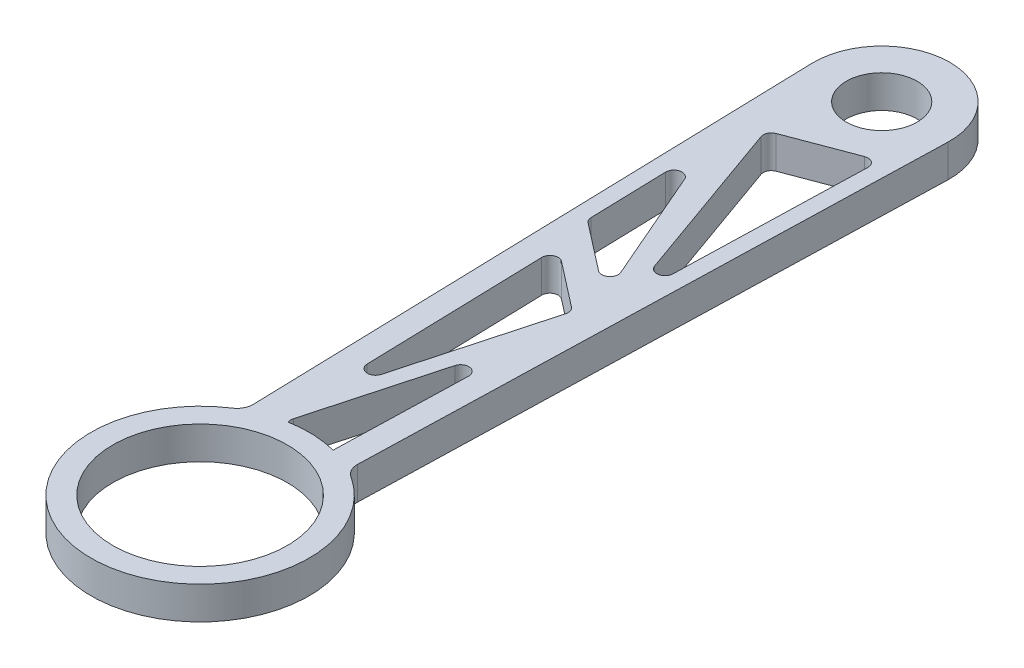
ISO-10303-21;
HEADER;
FILE_DESCRIPTION(('STEP AP214'),'2;1');
FILE_NAME('part.step','',(''),(''),'','','');
FILE_SCHEMA(('AUTOMOTIVE_DESIGN { 1 0 10303 214 1 1 1 1 }'));
ENDSEC;
DATA;
#1=APPLICATION_CONTEXT('core data for automotive mechanical design processes');
#2=APPLICATION_PROTOCOL_DEFINITION('international standard','automotive_design',2000,#1);
#3=PRODUCT_CONTEXT('',#1,'mechanical');
#4=PRODUCT('Part','Part','',(#3));
#5=PRODUCT_RELATED_PRODUCT_CATEGORY('part','',(#4));
#6=PRODUCT_DEFINITION_FORMATION('','',#4);
#7=PRODUCT_DEFINITION_CONTEXT('part definition',#1,'design');
#8=PRODUCT_DEFINITION('design','',#6,#7);
#9=PRODUCT_DEFINITION_SHAPE('','',#8);
#10=(LENGTH_UNIT() NAMED_UNIT(*) SI_UNIT(.MILLI.,.METRE.));
#11=(NAMED_UNIT(*) PLANE_ANGLE_UNIT() SI_UNIT($,.RADIAN.));
#12=(NAMED_UNIT(*) SI_UNIT($,.STERADIAN.) SOLID_ANGLE_UNIT());
#13=UNCERTAINTY_MEASURE_WITH_UNIT(LENGTH_MEASURE(1.E-05),#10,'distance_accuracy_value','');
#14=(GEOMETRIC_REPRESENTATION_CONTEXT(3) GLOBAL_UNCERTAINTY_ASSIGNED_CONTEXT((#13)) GLOBAL_UNIT_ASSIGNED_CONTEXT((#10,
#11,#12)) REPRESENTATION_CONTEXT('',''));
#15=CARTESIAN_POINT('',(0.,0.,0.));
#16=DIRECTION('',(0.,0.,1.));
#17=DIRECTION('',(1.,0.,0.));
#18=AXIS2_PLACEMENT_3D('',#15,#16,#17);
#19=CARTESIAN_POINT('',(0.,12.,0.));
#20=DIRECTION('',(0.,1.,0.));
#21=DIRECTION('',(0.,0.,1.));
#22=AXIS2_PLACEMENT_3D('',#19,#20,#21);
#23=PLANE('',#22);
#24=CARTESIAN_POINT('',(0.,12.,0.));
#25=DIRECTION('',(0.,1.,0.));
#26=DIRECTION('',(0.,0.,1.));
#27=AXIS2_PLACEMENT_3D('',#24,#25,#26);
#28=CIRCLE('',#27,32.);
#29=CARTESIAN_POINT('',(0.,12.,32.));
#30=VERTEX_POINT('',#29);
#31=EDGE_CURVE('E478',#30,#30,#28,.T.);
#32=ORIENTED_EDGE('',*,*,#31,.F.);
#33=EDGE_LOOP('',(#32));
#34=FACE_BOUND('',#33,.T.);
#35=DIRECTION('',(-0.789952118654972,0.,-0.613168533302649));
#36=VECTOR('',#35,1.);
#37=CARTESIAN_POINT('',(-13.0503430260789,12.,-144.472367447696));
#38=LINE('',#37,#36);
#39=CARTESIAN_POINT('',(8.34644282073465,12.,-127.863973742239));
#40=VERTEX_POINT('',#39);
#41=CARTESIAN_POINT('',(-8.03421610357233,12.,-140.578800843722));
#42=VERTEX_POINT('',#41);
#43=EDGE_CURVE('E310',#40,#42,#38,.T.);
#44=ORIENTED_EDGE('',*,*,#43,.F.);
#45=CARTESIAN_POINT('',(6.50693722082672,12.,-125.494117386274));
#46=DIRECTION('',(0.,1.,0.));
#47=DIRECTION('',(0.,0.,1.));
#48=AXIS2_PLACEMENT_3D('',#45,#46,#47);
#49=CIRCLE('',#48,3.);
#50=CARTESIAN_POINT('',(9.40048928643597,12.,-124.70205902756));
#51=VERTEX_POINT('',#50);
#52=EDGE_CURVE('E47',#40,#51,#49,.F.);
#53=ORIENTED_EDGE('',*,*,#52,.T.);
#54=DIRECTION('',(-0.264019452904616,0.,0.964517355203082));
#55=VECTOR('',#54,1.);
#56=CARTESIAN_POINT('',(9.60137553040454,12.,-125.43593778762));
#57=LINE('',#56,#55);
#58=CARTESIAN_POINT('',(-5.1364514497771,12.,-71.5956250986117));
#59=VERTEX_POINT('',#58);
#60=EDGE_CURVE('E307',#51,#59,#57,.T.);
#61=ORIENTED_EDGE('',*,*,#60,.T.);
#62=CARTESIAN_POINT('',(-8.03000351538634,12.,-72.3876834573256));
#63=DIRECTION('',(0.,1.,0.));
#64=DIRECTION('',(0.,0.,1.));
#65=AXIS2_PLACEMENT_3D('',#62,#63,#64);
#66=CIRCLE('',#65,3.);
#67=CARTESIAN_POINT('',(-11.0288272847999,12.,-72.3036834573255));
#68=VERTEX_POINT('',#67);
#69=EDGE_CURVE('E301',#59,#68,#66,.F.);
#70=ORIENTED_EDGE('',*,*,#69,.T.);
#71=DIRECTION('',(0.028,0.,0.999607923137867));
#72=VECTOR('',#71,1.);
#73=CARTESIAN_POINT('',(-10.1751058159417,12.,-41.8255854421963));
#74=LINE('',#73,#72);
#75=CARTESIAN_POINT('',(-12.8725454728939,12.,-138.124944487757));
#76=VERTEX_POINT('',#75);
#77=EDGE_CURVE('E335',#76,#68,#74,.T.);
#78=ORIENTED_EDGE('',*,*,#77,.F.);
#79=CARTESIAN_POINT('',(-9.87372170348028,12.,-138.208944487757));
#80=DIRECTION('',(0.,1.,0.));
#81=DIRECTION('',(0.,0.,1.));
#82=AXIS2_PLACEMENT_3D('',#79,#80,#81);
#83=CIRCLE('',#82,3.);
#84=EDGE_CURVE('E261',#76,#42,#83,.F.);
#85=ORIENTED_EDGE('',*,*,#84,.T.);
#86=EDGE_LOOP('',(#44,#53,#61,#70,#78,#85));
#87=FACE_BOUND('',#86,.T.);
#88=CARTESIAN_POINT('',(0.,12.,0.));
#89=DIRECTION('',(0.,1.,0.));
#90=DIRECTION('',(0.,0.,1.));
#91=AXIS2_PLACEMENT_3D('',#88,#89,#90);
#92=CIRCLE('',#91,40.);
#93=CARTESIAN_POINT('',(10.0877531233555,12.,-38.7070695987468));
#94=VERTEX_POINT('',#93);
#95=CARTESIAN_POINT('',(-7.02274033121261,12.,-39.3786886302777));
#96=VERTEX_POINT('',#95);
#97=EDGE_CURVE('E470',#94,#96,#92,.T.);
#98=ORIENTED_EDGE('',*,*,#97,.T.);
#99=CARTESIAN_POINT('',(-4.28710421094955,12.,-40.6100679453191));
#100=DIRECTION('',(0.,1.,0.));
#101=DIRECTION('',(0.,0.,1.));
#102=AXIS2_PLACEMENT_3D('',#99,#100,#101);
#103=CIRCLE('',#102,3.);
#104=CARTESIAN_POINT('',(-7.1806562765588,12.,-41.4021263040329));
#105=VERTEX_POINT('',#104);
#106=EDGE_CURVE('E243',#96,#105,#103,.F.);
#107=ORIENTED_EDGE('',*,*,#106,.T.);
#108=DIRECTION('',(0.264019452904616,0.,-0.964517355203082));
#109=VECTOR('',#108,1.);
#110=CARTESIAN_POINT('',(15.388479661623,12.,-123.851821070192));
#111=LINE('',#110,#109);
#112=CARTESIAN_POINT('',(5.54894809663972,12.,-87.9059888328851));
#113=VERTEX_POINT('',#112);
#114=EDGE_CURVE('E315',#105,#113,#111,.T.);
#115=ORIENTED_EDGE('',*,*,#114,.T.);
#116=CARTESIAN_POINT('',(8.44250016224896,12.,-87.1139304741712));
#117=DIRECTION('',(0.,1.,0.));
#118=DIRECTION('',(0.,0.,1.));
#119=AXIS2_PLACEMENT_3D('',#116,#117,#118);
#120=CIRCLE('',#119,3.);
#121=CARTESIAN_POINT('',(11.4413239316626,12.,-87.0299304741712));
#122=VERTEX_POINT('',#121);
#123=EDGE_CURVE('E297',#113,#122,#120,.F.);
#124=ORIENTED_EDGE('',*,*,#123,.T.);
#125=DIRECTION('',(0.028,0.,-0.999607923137867));
#126=VECTOR('',#125,1.);
#127=CARTESIAN_POINT('',(12.4949275960138,12.,-124.643879428906));
#128=LINE('',#127,#126);
#129=EDGE_CURVE('E338',#94,#122,#128,.T.);
#130=ORIENTED_EDGE('',*,*,#129,.F.);
#131=EDGE_LOOP('',(#98,#107,#115,#124,#130));
#132=FACE_BOUND('',#131,.T.);
#133=DIRECTION('',(0.028,0.,0.999607923137867));
#134=VECTOR('',#133,1.);
#135=CARTESIAN_POINT('',(-17.9929426164816,12.,0.504));
#136=LINE('',#135,#134);
#137=CARTESIAN_POINT('',(-24.9901980784467,12.,-249.3));
#138=VERTEX_POINT('',#137);
#139=CARTESIAN_POINT('',(-19.0917419612211,12.,-38.7234475335829));
#140=VERTEX_POINT('',#139);
#141=EDGE_CURVE('E386',#138,#140,#136,.T.);
#142=ORIENTED_EDGE('',*,*,#141,.T.);
#143=CARTESIAN_POINT('',(-25.0893895000483,12.,-38.5554475335829));
#144=DIRECTION('',(0.,1.,0.));
#145=DIRECTION('',(0.,0.,1.));
#146=AXIS2_PLACEMENT_3D('',#143,#144,#145);
#147=CIRCLE('',#146,6.);
#148=CARTESIAN_POINT('',(-21.8168604348246,12.,-33.5264761161591));
#149=VERTEX_POINT('',#148);
#150=EDGE_CURVE('E271',#140,#149,#147,.F.);
#151=ORIENTED_EDGE('',*,*,#150,.T.);
#152=CARTESIAN_POINT('',(21.8168604348246,12.,-33.5264761161591));
#153=VERTEX_POINT('',#152);
#154=EDGE_CURVE('E468',#149,#153,#92,.T.);
#155=ORIENTED_EDGE('',*,*,#154,.T.);
#156=CARTESIAN_POINT('',(25.0893895000483,12.,-38.5554475335829));
#157=DIRECTION('',(0.,1.,0.));
#158=DIRECTION('',(0.,0.,1.));
#159=AXIS2_PLACEMENT_3D('',#156,#157,#158);
#160=CIRCLE('',#159,6.);
#161=CARTESIAN_POINT('',(19.0917419612211,12.,-38.7234475335829));
#162=VERTEX_POINT('',#161);
#163=EDGE_CURVE('E277',#153,#162,#160,.F.);
#164=ORIENTED_EDGE('',*,*,#163,.T.);
#165=DIRECTION('',(0.028,0.,-0.999607923137867));
#166=VECTOR('',#165,1.);
#167=CARTESIAN_POINT('',(17.9929426164816,12.,0.504));
#168=LINE('',#167,#166);
#169=CARTESIAN_POINT('',(24.9901980784467,12.,-249.3));
#170=VERTEX_POINT('',#169);
#171=EDGE_CURVE('E381',#162,#170,#168,.T.);
#172=ORIENTED_EDGE('',*,*,#171,.T.);
#173=CARTESIAN_POINT('',(0.,12.,-250.));
#174=DIRECTION('',(0.,1.,0.));
#175=DIRECTION('',(0.,0.,-1.));
#176=AXIS2_PLACEMENT_3D('',#173,#174,#175);
#177=CIRCLE('',#176,25.);
#178=EDGE_CURVE('E383',#170,#138,#177,.T.);
#179=ORIENTED_EDGE('',*,*,#178,.T.);
#180=EDGE_LOOP('',(#142,#151,#155,#164,#172,#179));
#181=FACE_BOUND('',#180,.T.);
#182=CARTESIAN_POINT('',(0.,12.,-250.));
#183=DIRECTION('',(0.,1.,0.));
#184=DIRECTION('',(0.,0.,1.));
#185=AXIS2_PLACEMENT_3D('',#182,#183,#184);
#186=CIRCLE('',#185,13.);
#187=CARTESIAN_POINT('',(0.,12.,-237.));
#188=VERTEX_POINT('',#187);
#189=EDGE_CURVE('E375',#188,#188,#186,.T.);
#190=ORIENTED_EDGE('',*,*,#189,.F.);
#191=EDGE_LOOP('',(#190));
#192=FACE_BOUND('',#191,.T.);
#193=DIRECTION('',(-0.397525373663088,0.,-0.917591182005376));
#194=VECTOR('',#193,1.);
#195=CARTESIAN_POINT('',(-17.7049416979852,12.,-203.5));
#196=LINE('',#195,#194);
#197=CARTESIAN_POINT('',(6.37692660368525,12.,-147.912831321415));
#198=VERTEX_POINT('',#197);
#199=CARTESIAN_POINT('',(-11.5175293173122,12.,-189.217854969559));
#200=VERTEX_POINT('',#199);
#201=EDGE_CURVE('E360',#198,#200,#196,.T.);
#202=ORIENTED_EDGE('',*,*,#201,.F.);
#203=CARTESIAN_POINT('',(3.62415305766912,12.,-146.720255200426));
#204=DIRECTION('',(0.,1.,0.));
#205=DIRECTION('',(0.,0.,1.));
#206=AXIS2_PLACEMENT_3D('',#203,#204,#205);
#207=CIRCLE('',#206,3.);
#208=CARTESIAN_POINT('',(1.78464745776116,12.,-144.350398844461));
#209=VERTEX_POINT('',#208);
#210=EDGE_CURVE('E452',#198,#209,#207,.F.);
#211=ORIENTED_EDGE('',*,*,#210,.T.);
#212=DIRECTION('',(0.789952118654972,0.,0.613168533302648));
#213=VECTOR('',#212,1.);
#214=CARTESIAN_POINT('',(11.0288712194541,12.,-137.174942267257));
#215=LINE('',#214,#213);
#216=CARTESIAN_POINT('',(-15.3248149033725,12.,-157.630930276462));
#217=VERTEX_POINT('',#216);
#218=EDGE_CURVE('E357',#217,#209,#215,.T.);
#219=ORIENTED_EDGE('',*,*,#218,.F.);
#220=CARTESIAN_POINT('',(-13.4853093034645,12.,-160.000786632427));
#221=DIRECTION('',(0.,1.,0.));
#222=DIRECTION('',(0.,0.,1.));
#223=AXIS2_PLACEMENT_3D('',#220,#221,#222);
#224=CIRCLE('',#223,3.);
#225=CARTESIAN_POINT('',(-16.4841330728781,12.,-159.916786632427));
#226=VERTEX_POINT('',#225);
#227=EDGE_CURVE('E444',#217,#226,#224,.F.);
#228=ORIENTED_EDGE('',*,*,#227,.T.);
#229=DIRECTION('',(0.028,0.,0.999607923137867));
#230=VECTOR('',#229,1.);
#231=CARTESIAN_POINT('',(-16.4444474873704,12.,-158.5));
#232=LINE('',#231,#230);
#233=CARTESIAN_POINT('',(-17.2691266327419,12.,-187.94127884857));
#234=VERTEX_POINT('',#233);
#235=EDGE_CURVE('E364',#234,#226,#232,.T.);
#236=ORIENTED_EDGE('',*,*,#235,.F.);
#237=CARTESIAN_POINT('',(-14.2703028633283,12.,-188.02527884857));
#238=DIRECTION('',(0.,1.,0.));
#239=DIRECTION('',(0.,0.,1.));
#240=AXIS2_PLACEMENT_3D('',#237,#238,#239);
#241=CIRCLE('',#240,3.);
#242=EDGE_CURVE('E440',#234,#200,#241,.F.);
#243=ORIENTED_EDGE('',*,*,#242,.T.);
#244=EDGE_LOOP('',(#202,#211,#219,#228,#236,#243));
#245=FACE_BOUND('',#244,.T.);
#246=DIRECTION('',(0.335469277320512,0.,0.94205114721763));
#247=VECTOR('',#246,1.);
#248=CARTESIAN_POINT('',(-12.,12.,-219.5));
#249=LINE('',#248,#247);
#250=CARTESIAN_POINT('',(-11.0122686365186,12.,-216.726293055678));
#251=VERTEX_POINT('',#250);
#252=CARTESIAN_POINT('',(10.5780075140444,12.,-156.097359822692));
#253=VERTEX_POINT('',#252);
#254=EDGE_CURVE('E345',#251,#253,#249,.T.);
#255=ORIENTED_EDGE('',*,*,#254,.F.);
#256=CARTESIAN_POINT('',(-8.18611519486575,12.,-217.73270088764));
#257=DIRECTION('',(0.,1.,0.));
#258=DIRECTION('',(0.,0.,1.));
#259=AXIS2_PLACEMENT_3D('',#256,#257,#258);
#260=CIRCLE('',#259,3.);
#261=CARTESIAN_POINT('',(-9.24527953761206,12.,-220.539508842427));
#262=VERTEX_POINT('',#261);
#263=EDGE_CURVE('E436',#251,#262,#260,.F.);
#264=ORIENTED_EDGE('',*,*,#263,.T.);
#265=DIRECTION('',(-0.93560265159562,0.,0.353054780915433));
#266=VECTOR('',#265,1.);
#267=CARTESIAN_POINT('',(18.4752437155831,12.,-231.));
#268=LINE('',#267,#266);
#269=CARTESIAN_POINT('',(14.2920646215098,12.,-229.421454475285));
#270=VERTEX_POINT('',#269);
#271=EDGE_CURVE('E342',#270,#262,#268,.T.);
#272=ORIENTED_EDGE('',*,*,#271,.F.);
#273=CARTESIAN_POINT('',(15.3512289642561,12.,-226.614646520498));
#274=DIRECTION('',(0.,1.,0.));
#275=DIRECTION('',(0.,0.,1.));
#276=AXIS2_PLACEMENT_3D('',#273,#274,#275);
#277=CIRCLE('',#276,3.);
#278=CARTESIAN_POINT('',(18.3500527336697,12.,-226.530646520498));
#279=VERTEX_POINT('',#278);
#280=EDGE_CURVE('E432',#270,#279,#277,.F.);
#281=ORIENTED_EDGE('',*,*,#280,.T.);
#282=DIRECTION('',(0.028,0.,-0.999607923137867));
#283=VECTOR('',#282,1.);
#284=CARTESIAN_POINT('',(15.9542552943535,12.,-141.));
#285=LINE('',#284,#283);
#286=CARTESIAN_POINT('',(16.4029847251109,12.,-157.019767654654));
#287=VERTEX_POINT('',#286);
#288=EDGE_CURVE('E349',#287,#279,#285,.T.);
#289=ORIENTED_EDGE('',*,*,#288,.F.);
#290=CARTESIAN_POINT('',(13.4041609556973,12.,-157.103767654654));
#291=DIRECTION('',(0.,1.,0.));
#292=DIRECTION('',(0.,0.,1.));
#293=AXIS2_PLACEMENT_3D('',#290,#291,#292);
#294=CIRCLE('',#293,3.);
#295=EDGE_CURVE('E448',#287,#253,#294,.F.);
#296=ORIENTED_EDGE('',*,*,#295,.T.);
#297=EDGE_LOOP('',(#255,#264,#272,#281,#289,#296));
#298=FACE_BOUND('',#297,.T.);
#299=ADVANCED_FACE('F39',(#34,#87,#132,#181,#192,#245,#298),#23,.T.);
#300=CARTESIAN_POINT('',(0.,0.,0.));
#301=DIRECTION('',(0.,1.,0.));
#302=DIRECTION('',(0.,0.,1.));
#303=AXIS2_PLACEMENT_3D('',#300,#301,#302);
#304=PLANE('',#303);
#305=CARTESIAN_POINT('',(0.,0.,0.));
#306=DIRECTION('',(0.,1.,0.));
#307=DIRECTION('',(0.,0.,1.));
#308=AXIS2_PLACEMENT_3D('',#305,#306,#307);
#309=CIRCLE('',#308,32.);
#310=CARTESIAN_POINT('',(0.,0.,32.));
#311=VERTEX_POINT('',#310);
#312=EDGE_CURVE('E316',#311,#311,#309,.T.);
#313=ORIENTED_EDGE('',*,*,#312,.T.);
#314=EDGE_LOOP('',(#313));
#315=FACE_BOUND('',#314,.T.);
#316=DIRECTION('',(0.028,0.,0.999607923137867));
#317=VECTOR('',#316,1.);
#318=CARTESIAN_POINT('',(-10.1751058159417,0.,-41.8255854421963));
#319=LINE('',#318,#317);
#320=CARTESIAN_POINT('',(-12.8725454728939,0.,-138.124944487757));
#321=VERTEX_POINT('',#320);
#322=CARTESIAN_POINT('',(-11.0288272847999,0.,-72.3036834573255));
#323=VERTEX_POINT('',#322);
#324=EDGE_CURVE('E331',#321,#323,#319,.T.);
#325=ORIENTED_EDGE('',*,*,#324,.T.);
#326=CARTESIAN_POINT('',(-8.03000351538634,0.,-72.3876834573256));
#327=DIRECTION('',(0.,1.,0.));
#328=DIRECTION('',(0.,0.,1.));
#329=AXIS2_PLACEMENT_3D('',#326,#327,#328);
#330=CIRCLE('',#329,3.);
#331=CARTESIAN_POINT('',(-5.1364514497771,0.,-71.5956250986117));
#332=VERTEX_POINT('',#331);
#333=EDGE_CURVE('E299',#323,#332,#330,.T.);
#334=ORIENTED_EDGE('',*,*,#333,.T.);
#335=DIRECTION('',(0.264019452904616,0.,-0.964517355203082));
#336=VECTOR('',#335,1.);
#337=CARTESIAN_POINT('',(9.60137553040454,0.,-125.43593778762));
#338=LINE('',#337,#336);
#339=CARTESIAN_POINT('',(9.40048928643597,0.,-124.70205902756));
#340=VERTEX_POINT('',#339);
#341=EDGE_CURVE('E471',#332,#340,#338,.T.);
#342=ORIENTED_EDGE('',*,*,#341,.T.);
#343=CARTESIAN_POINT('',(6.50693722082672,0.,-125.494117386274));
#344=DIRECTION('',(0.,1.,0.));
#345=DIRECTION('',(0.,0.,1.));
#346=AXIS2_PLACEMENT_3D('',#343,#344,#345);
#347=CIRCLE('',#346,3.);
#348=CARTESIAN_POINT('',(8.34644282073465,0.,-127.863973742239));
#349=VERTEX_POINT('',#348);
#350=EDGE_CURVE('E11',#340,#349,#347,.T.);
#351=ORIENTED_EDGE('',*,*,#350,.T.);
#352=DIRECTION('',(-0.789952118654972,0.,-0.613168533302649));
#353=VECTOR('',#352,1.);
#354=CARTESIAN_POINT('',(-13.0503430260789,0.,-144.472367447696));
#355=LINE('',#354,#353);
#356=CARTESIAN_POINT('',(-8.03421610357233,0.,-140.578800843722));
#357=VERTEX_POINT('',#356);
#358=EDGE_CURVE('E321',#349,#357,#355,.T.);
#359=ORIENTED_EDGE('',*,*,#358,.T.);
#360=CARTESIAN_POINT('',(-9.87372170348028,0.,-138.208944487757));
#361=DIRECTION('',(0.,1.,0.));
#362=DIRECTION('',(0.,0.,1.));
#363=AXIS2_PLACEMENT_3D('',#360,#361,#362);
#364=CIRCLE('',#363,3.);
#365=EDGE_CURVE('E256',#357,#321,#364,.T.);
#366=ORIENTED_EDGE('',*,*,#365,.T.);
#367=EDGE_LOOP('',(#325,#334,#342,#351,#359,#366));
#368=FACE_BOUND('',#367,.T.);
#369=DIRECTION('',(0.028,0.,-0.999607923137867));
#370=VECTOR('',#369,1.);
#371=CARTESIAN_POINT('',(12.4949275960138,0.,-124.643879428906));
#372=LINE('',#371,#370);
#373=CARTESIAN_POINT('',(10.0877531233555,0.,-38.7070695987468));
#374=VERTEX_POINT('',#373);
#375=CARTESIAN_POINT('',(11.4413239316626,0.,-87.0299304741712));
#376=VERTEX_POINT('',#375);
#377=EDGE_CURVE('E326',#374,#376,#372,.T.);
#378=ORIENTED_EDGE('',*,*,#377,.T.);
#379=CARTESIAN_POINT('',(8.44250016224896,0.,-87.1139304741712));
#380=DIRECTION('',(0.,1.,0.));
#381=DIRECTION('',(0.,0.,1.));
#382=AXIS2_PLACEMENT_3D('',#379,#380,#381);
#383=CIRCLE('',#382,3.);
#384=CARTESIAN_POINT('',(5.54894809663972,0.,-87.9059888328851));
#385=VERTEX_POINT('',#384);
#386=EDGE_CURVE('E242',#376,#385,#383,.T.);
#387=ORIENTED_EDGE('',*,*,#386,.T.);
#388=DIRECTION('',(-0.264019452904616,0.,0.964517355203082));
#389=VECTOR('',#388,1.);
#390=CARTESIAN_POINT('',(15.388479661623,0.,-123.851821070192));
#391=LINE('',#390,#389);
#392=CARTESIAN_POINT('',(-7.1806562765588,0.,-41.4021263040329));
#393=VERTEX_POINT('',#392);
#394=EDGE_CURVE('E238',#385,#393,#391,.T.);
#395=ORIENTED_EDGE('',*,*,#394,.T.);
#396=CARTESIAN_POINT('',(-4.28710421094955,0.,-40.6100679453191));
#397=DIRECTION('',(0.,1.,0.));
#398=DIRECTION('',(0.,0.,1.));
#399=AXIS2_PLACEMENT_3D('',#396,#397,#398);
#400=CIRCLE('',#399,3.);
#401=CARTESIAN_POINT('',(-7.02274033121261,0.,-39.3786886302777));
#402=VERTEX_POINT('',#401);
#403=EDGE_CURVE('E230',#393,#402,#400,.T.);
#404=ORIENTED_EDGE('',*,*,#403,.T.);
#405=CARTESIAN_POINT('',(0.,0.,0.));
#406=DIRECTION('',(0.,1.,0.));
#407=DIRECTION('',(0.,0.,1.));
#408=AXIS2_PLACEMENT_3D('',#405,#406,#407);
#409=CIRCLE('',#408,40.);
#410=EDGE_CURVE('E235',#402,#374,#409,.F.);
#411=ORIENTED_EDGE('',*,*,#410,.T.);
#412=EDGE_LOOP('',(#378,#387,#395,#404,#411));
#413=FACE_BOUND('',#412,.T.);
#414=DIRECTION('',(0.028,0.,-0.999607923137867));
#415=VECTOR('',#414,1.);
#416=CARTESIAN_POINT('',(17.9929426164816,0.,0.504));
#417=LINE('',#416,#415);
#418=CARTESIAN_POINT('',(19.0917419612211,0.,-38.7234475335829));
#419=VERTEX_POINT('',#418);
#420=CARTESIAN_POINT('',(24.9901980784467,0.,-249.3));
#421=VERTEX_POINT('',#420);
#422=EDGE_CURVE('E378',#419,#421,#417,.T.);
#423=ORIENTED_EDGE('',*,*,#422,.F.);
#424=CARTESIAN_POINT('',(25.0893895000483,0.,-38.5554475335829));
#425=DIRECTION('',(0.,1.,0.));
#426=DIRECTION('',(0.,0.,1.));
#427=AXIS2_PLACEMENT_3D('',#424,#425,#426);
#428=CIRCLE('',#427,6.);
#429=CARTESIAN_POINT('',(21.8168604348246,0.,-33.5264761161591));
#430=VERTEX_POINT('',#429);
#431=EDGE_CURVE('E275',#419,#430,#428,.T.);
#432=ORIENTED_EDGE('',*,*,#431,.T.);
#433=CARTESIAN_POINT('',(-21.8168604348246,0.,-33.5264761161591));
#434=VERTEX_POINT('',#433);
#435=EDGE_CURVE('E252',#430,#434,#409,.F.);
#436=ORIENTED_EDGE('',*,*,#435,.T.);
#437=CARTESIAN_POINT('',(-25.0893895000483,0.,-38.5554475335829));
#438=DIRECTION('',(0.,1.,0.));
#439=DIRECTION('',(0.,0.,1.));
#440=AXIS2_PLACEMENT_3D('',#437,#438,#439);
#441=CIRCLE('',#440,6.);
#442=CARTESIAN_POINT('',(-19.0917419612211,0.,-38.7234475335829));
#443=VERTEX_POINT('',#442);
#444=EDGE_CURVE('E273',#434,#443,#441,.T.);
#445=ORIENTED_EDGE('',*,*,#444,.T.);
#446=DIRECTION('',(0.028,0.,0.999607923137867));
#447=VECTOR('',#446,1.);
#448=CARTESIAN_POINT('',(-17.9929426164816,0.,0.504));
#449=LINE('',#448,#447);
#450=CARTESIAN_POINT('',(-24.9901980784467,0.,-249.3));
#451=VERTEX_POINT('',#450);
#452=EDGE_CURVE('E384',#451,#443,#449,.T.);
#453=ORIENTED_EDGE('',*,*,#452,.F.);
#454=CARTESIAN_POINT('',(0.,0.,-250.));
#455=DIRECTION('',(0.,1.,0.));
#456=DIRECTION('',(0.,0.,-1.));
#457=AXIS2_PLACEMENT_3D('',#454,#455,#456);
#458=CIRCLE('',#457,25.);
#459=EDGE_CURVE('E391',#421,#451,#458,.T.);
#460=ORIENTED_EDGE('',*,*,#459,.F.);
#461=EDGE_LOOP('',(#423,#432,#436,#445,#453,#460));
#462=FACE_BOUND('',#461,.T.);
#463=DIRECTION('',(0.028,0.,0.999607923137867));
#464=VECTOR('',#463,1.);
#465=CARTESIAN_POINT('',(-16.4444474873704,0.,-158.5));
#466=LINE('',#465,#464);
#467=CARTESIAN_POINT('',(-17.2691266327419,0.,-187.94127884857));
#468=VERTEX_POINT('',#467);
#469=CARTESIAN_POINT('',(-16.4841330728781,0.,-159.916786632427));
#470=VERTEX_POINT('',#469);
#471=EDGE_CURVE('E361',#468,#470,#466,.T.);
#472=ORIENTED_EDGE('',*,*,#471,.T.);
#473=CARTESIAN_POINT('',(-13.4853093034645,0.,-160.000786632427));
#474=DIRECTION('',(0.,1.,0.));
#475=DIRECTION('',(0.,0.,1.));
#476=AXIS2_PLACEMENT_3D('',#473,#474,#475);
#477=CIRCLE('',#476,3.);
#478=CARTESIAN_POINT('',(-15.3248149033725,0.,-157.630930276462));
#479=VERTEX_POINT('',#478);
#480=EDGE_CURVE('E442',#470,#479,#477,.T.);
#481=ORIENTED_EDGE('',*,*,#480,.T.);
#482=DIRECTION('',(0.789952118654972,0.,0.613168533302648));
#483=VECTOR('',#482,1.);
#484=CARTESIAN_POINT('',(11.0288712194541,0.,-137.174942267257));
#485=LINE('',#484,#483);
#486=CARTESIAN_POINT('',(1.78464745776116,0.,-144.350398844461));
#487=VERTEX_POINT('',#486);
#488=EDGE_CURVE('E351',#479,#487,#485,.T.);
#489=ORIENTED_EDGE('',*,*,#488,.T.);
#490=CARTESIAN_POINT('',(3.62415305766912,0.,-146.720255200426));
#491=DIRECTION('',(0.,1.,0.));
#492=DIRECTION('',(0.,0.,1.));
#493=AXIS2_PLACEMENT_3D('',#490,#491,#492);
#494=CIRCLE('',#493,3.);
#495=CARTESIAN_POINT('',(6.37692660368525,0.,-147.912831321415));
#496=VERTEX_POINT('',#495);
#497=EDGE_CURVE('E450',#487,#496,#494,.T.);
#498=ORIENTED_EDGE('',*,*,#497,.T.);
#499=DIRECTION('',(-0.397525373663088,0.,-0.917591182005376));
#500=VECTOR('',#499,1.);
#501=CARTESIAN_POINT('',(-17.7049416979852,0.,-203.5));
#502=LINE('',#501,#500);
#503=CARTESIAN_POINT('',(-11.5175293173122,0.,-189.217854969559));
#504=VERTEX_POINT('',#503);
#505=EDGE_CURVE('E370',#496,#504,#502,.T.);
#506=ORIENTED_EDGE('',*,*,#505,.T.);
#507=CARTESIAN_POINT('',(-14.2703028633283,0.,-188.02527884857));
#508=DIRECTION('',(0.,1.,0.));
#509=DIRECTION('',(0.,0.,1.));
#510=AXIS2_PLACEMENT_3D('',#507,#508,#509);
#511=CIRCLE('',#510,3.);
#512=EDGE_CURVE('E438',#504,#468,#511,.T.);
#513=ORIENTED_EDGE('',*,*,#512,.T.);
#514=EDGE_LOOP('',(#472,#481,#489,#498,#506,#513));
#515=FACE_BOUND('',#514,.T.);
#516=CARTESIAN_POINT('',(0.,0.,-250.));
#517=DIRECTION('',(0.,1.,0.));
#518=DIRECTION('',(0.,0.,1.));
#519=AXIS2_PLACEMENT_3D('',#516,#517,#518);
#520=CIRCLE('',#519,13.);
#521=CARTESIAN_POINT('',(0.,0.,-237.));
#522=VERTEX_POINT('',#521);
#523=EDGE_CURVE('E367',#522,#522,#520,.T.);
#524=ORIENTED_EDGE('',*,*,#523,.T.);
#525=EDGE_LOOP('',(#524));
#526=FACE_BOUND('',#525,.T.);
#527=DIRECTION('',(0.028,0.,-0.999607923137867));
#528=VECTOR('',#527,1.);
#529=CARTESIAN_POINT('',(15.9542552943535,0.,-141.));
#530=LINE('',#529,#528);
#531=CARTESIAN_POINT('',(16.4029847251109,0.,-157.019767654654));
#532=VERTEX_POINT('',#531);
#533=CARTESIAN_POINT('',(18.3500527336697,0.,-226.530646520498));
#534=VERTEX_POINT('',#533);
#535=EDGE_CURVE('E346',#532,#534,#530,.T.);
#536=ORIENTED_EDGE('',*,*,#535,.T.);
#537=CARTESIAN_POINT('',(15.3512289642561,0.,-226.614646520498));
#538=DIRECTION('',(0.,1.,0.));
#539=DIRECTION('',(0.,0.,1.));
#540=AXIS2_PLACEMENT_3D('',#537,#538,#539);
#541=CIRCLE('',#540,3.);
#542=CARTESIAN_POINT('',(14.2920646215098,0.,-229.421454475285));
#543=VERTEX_POINT('',#542);
#544=EDGE_CURVE('E430',#534,#543,#541,.T.);
#545=ORIENTED_EDGE('',*,*,#544,.T.);
#546=DIRECTION('',(-0.93560265159562,0.,0.353054780915433));
#547=VECTOR('',#546,1.);
#548=CARTESIAN_POINT('',(18.4752437155831,0.,-231.));
#549=LINE('',#548,#547);
#550=CARTESIAN_POINT('',(-9.24527953761206,0.,-220.539508842427));
#551=VERTEX_POINT('',#550);
#552=EDGE_CURVE('E325',#543,#551,#549,.T.);
#553=ORIENTED_EDGE('',*,*,#552,.T.);
#554=CARTESIAN_POINT('',(-8.18611519486575,0.,-217.73270088764));
#555=DIRECTION('',(0.,1.,0.));
#556=DIRECTION('',(0.,0.,1.));
#557=AXIS2_PLACEMENT_3D('',#554,#555,#556);
#558=CIRCLE('',#557,3.);
#559=CARTESIAN_POINT('',(-11.0122686365186,0.,-216.726293055678));
#560=VERTEX_POINT('',#559);
#561=EDGE_CURVE('E434',#551,#560,#558,.T.);
#562=ORIENTED_EDGE('',*,*,#561,.T.);
#563=DIRECTION('',(0.335469277320512,0.,0.94205114721763));
#564=VECTOR('',#563,1.);
#565=CARTESIAN_POINT('',(-12.,0.,-219.5));
#566=LINE('',#565,#564);
#567=CARTESIAN_POINT('',(10.5780075140444,0.,-156.097359822692));
#568=VERTEX_POINT('',#567);
#569=EDGE_CURVE('E329',#560,#568,#566,.T.);
#570=ORIENTED_EDGE('',*,*,#569,.T.);
#571=CARTESIAN_POINT('',(13.4041609556973,0.,-157.103767654654));
#572=DIRECTION('',(0.,1.,0.));
#573=DIRECTION('',(0.,0.,1.));
#574=AXIS2_PLACEMENT_3D('',#571,#572,#573);
#575=CIRCLE('',#574,3.);
#576=EDGE_CURVE('E446',#568,#532,#575,.T.);
#577=ORIENTED_EDGE('',*,*,#576,.T.);
#578=EDGE_LOOP('',(#536,#545,#553,#562,#570,#577));
#579=FACE_BOUND('',#578,.T.);
#580=ADVANCED_FACE('F233',(#315,#368,#413,#462,#515,#526,#579),#304,.F.);
#581=CARTESIAN_POINT('',(17.9929426164816,12.,0.504));
#582=DIRECTION('',(-0.999607923137867,0.,-0.028));
#583=DIRECTION('',(-0.028,0.,0.999607923137867));
#584=AXIS2_PLACEMENT_3D('',#581,#582,#583);
#585=PLANE('',#584);
#586=ORIENTED_EDGE('',*,*,#171,.F.);
#587=DIRECTION('',(0.,1.,0.));
#588=VECTOR('',#587,1.);
#589=CARTESIAN_POINT('',(19.0917419612211,12.,-38.7234475335829));
#590=LINE('',#589,#588);
#591=EDGE_CURVE('E268',#162,#419,#590,.F.);
#592=ORIENTED_EDGE('',*,*,#591,.T.);
#593=ORIENTED_EDGE('',*,*,#422,.T.);
#594=DIRECTION('',(0.,-1.,0.));
#595=VECTOR('',#594,1.);
#596=CARTESIAN_POINT('',(24.9901980784467,12.,-249.3));
#597=LINE('',#596,#595);
#598=EDGE_CURVE('E397',#170,#421,#597,.T.);
#599=ORIENTED_EDGE('',*,*,#598,.F.);
#600=EDGE_LOOP('',(#586,#592,#593,#599));
#601=FACE_BOUND('',#600,.T.);
#602=ADVANCED_FACE('F496',(#601),#585,.F.);
#603=CARTESIAN_POINT('',(0.,12.,-250.));
#604=DIRECTION('',(0.,-1.,0.));
#605=DIRECTION('',(0.,0.,-1.));
#606=AXIS2_PLACEMENT_3D('',#603,#604,#605);
#607=CYLINDRICAL_SURFACE('',#606,25.);
#608=ORIENTED_EDGE('',*,*,#459,.T.);
#609=DIRECTION('',(0.,-1.,0.));
#610=VECTOR('',#609,1.);
#611=CARTESIAN_POINT('',(-24.9901980784467,12.,-249.3));
#612=LINE('',#611,#610);
#613=EDGE_CURVE('E389',#138,#451,#612,.T.);
#614=ORIENTED_EDGE('',*,*,#613,.F.);
#615=ORIENTED_EDGE('',*,*,#178,.F.);
#616=ORIENTED_EDGE('',*,*,#598,.T.);
#617=EDGE_LOOP('',(#608,#614,#615,#616));
#618=FACE_BOUND('',#617,.T.);
#619=ADVANCED_FACE('F505',(#618),#607,.T.);
#620=CARTESIAN_POINT('',(-17.9929426164816,12.,0.504));
#621=DIRECTION('',(0.999607923137867,0.,-0.028));
#622=DIRECTION('',(-0.028,0.,-0.999607923137867));
#623=AXIS2_PLACEMENT_3D('',#620,#621,#622);
#624=PLANE('',#623);
#625=ORIENTED_EDGE('',*,*,#452,.T.);
#626=DIRECTION('',(0.,1.,0.));
#627=VECTOR('',#626,1.);
#628=CARTESIAN_POINT('',(-19.0917419612211,12.,-38.7234475335829));
#629=LINE('',#628,#627);
#630=EDGE_CURVE('E255',#443,#140,#629,.T.);
#631=ORIENTED_EDGE('',*,*,#630,.T.);
#632=ORIENTED_EDGE('',*,*,#141,.F.);
#633=ORIENTED_EDGE('',*,*,#613,.T.);
#634=EDGE_LOOP('',(#625,#631,#632,#633));
#635=FACE_BOUND('',#634,.T.);
#636=ADVANCED_FACE('F502',(#635),#624,.F.);
#637=CARTESIAN_POINT('',(0.,12.,-250.));
#638=DIRECTION('',(0.,-1.,0.));
#639=DIRECTION('',(0.,0.,-1.));
#640=AXIS2_PLACEMENT_3D('',#637,#638,#639);
#641=CYLINDRICAL_SURFACE('',#640,13.);
#642=ORIENTED_EDGE('',*,*,#189,.T.);
#643=EDGE_LOOP('',(#642));
#644=FACE_BOUND('',#643,.T.);
#645=ORIENTED_EDGE('',*,*,#523,.F.);
#646=EDGE_LOOP('',(#645));
#647=FACE_BOUND('',#646,.T.);
#648=ADVANCED_FACE('F499',(#644,#647),#641,.F.);
#649=CARTESIAN_POINT('',(11.0288712194541,12.,-137.174942267257));
#650=DIRECTION('',(0.613168533302648,0.,-0.789952118654972));
#651=DIRECTION('',(-0.789952118654972,0.,-0.613168533302648));
#652=AXIS2_PLACEMENT_3D('',#649,#650,#651);
#653=PLANE('',#652);
#654=ORIENTED_EDGE('',*,*,#488,.F.);
#655=DIRECTION('',(0.,-1.,0.));
#656=VECTOR('',#655,1.);
#657=CARTESIAN_POINT('',(-15.3248149033725,12.,-157.630930276462));
#658=LINE('',#657,#656);
#659=EDGE_CURVE('E428',#479,#217,#658,.F.);
#660=ORIENTED_EDGE('',*,*,#659,.T.);
#661=ORIENTED_EDGE('',*,*,#218,.T.);
#662=DIRECTION('',(0.,-1.,0.));
#663=VECTOR('',#662,1.);
#664=CARTESIAN_POINT('',(1.78464745776116,0.,-144.350398844461));
#665=LINE('',#664,#663);
#666=EDGE_CURVE('E425',#209,#487,#665,.T.);
#667=ORIENTED_EDGE('',*,*,#666,.T.);
#668=EDGE_LOOP('',(#654,#660,#661,#667));
#669=FACE_BOUND('',#668,.T.);
#670=ADVANCED_FACE('F666',(#669),#653,.T.);
#671=CARTESIAN_POINT('',(-17.7049416979852,12.,-203.5));
#672=DIRECTION('',(-0.917591182005376,0.,0.397525373663088));
#673=DIRECTION('',(0.397525373663088,0.,0.917591182005376));
#674=AXIS2_PLACEMENT_3D('',#671,#672,#673);
#675=PLANE('',#674);
#676=ORIENTED_EDGE('',*,*,#201,.T.);
#677=DIRECTION('',(0.,-1.,0.));
#678=VECTOR('',#677,1.);
#679=CARTESIAN_POINT('',(-11.5175293173122,0.,-189.217854969559));
#680=LINE('',#679,#678);
#681=EDGE_CURVE('E417',#200,#504,#680,.T.);
#682=ORIENTED_EDGE('',*,*,#681,.T.);
#683=ORIENTED_EDGE('',*,*,#505,.F.);
#684=DIRECTION('',(0.,-1.,0.));
#685=VECTOR('',#684,1.);
#686=CARTESIAN_POINT('',(6.37692660368525,12.,-147.912831321415));
#687=LINE('',#686,#685);
#688=EDGE_CURVE('E415',#496,#198,#687,.F.);
#689=ORIENTED_EDGE('',*,*,#688,.T.);
#690=EDGE_LOOP('',(#676,#682,#683,#689));
#691=FACE_BOUND('',#690,.T.);
#692=ADVANCED_FACE('F676',(#691),#675,.T.);
#693=CARTESIAN_POINT('',(-16.4444474873704,12.,-158.5));
#694=DIRECTION('',(0.999607923137867,0.,-0.028));
#695=DIRECTION('',(-0.028,0.,-0.999607923137867));
#696=AXIS2_PLACEMENT_3D('',#693,#694,#695);
#697=PLANE('',#696);
#698=ORIENTED_EDGE('',*,*,#471,.F.);
#699=DIRECTION('',(0.,-1.,0.));
#700=VECTOR('',#699,1.);
#701=CARTESIAN_POINT('',(-17.2691266327419,12.,-187.94127884857));
#702=LINE('',#701,#700);
#703=EDGE_CURVE('E423',#468,#234,#702,.F.);
#704=ORIENTED_EDGE('',*,*,#703,.T.);
#705=ORIENTED_EDGE('',*,*,#235,.T.);
#706=DIRECTION('',(0.,-1.,0.));
#707=VECTOR('',#706,1.);
#708=CARTESIAN_POINT('',(-16.4841330728781,0.,-159.916786632427));
#709=LINE('',#708,#707);
#710=EDGE_CURVE('E420',#226,#470,#709,.T.);
#711=ORIENTED_EDGE('',*,*,#710,.T.);
#712=EDGE_LOOP('',(#698,#704,#705,#711));
#713=FACE_BOUND('',#712,.T.);
#714=ADVANCED_FACE('F686',(#713),#697,.T.);
#715=CARTESIAN_POINT('',(18.4752437155831,12.,-231.));
#716=DIRECTION('',(0.353054780915433,0.,0.93560265159562));
#717=DIRECTION('',(0.93560265159562,0.,-0.353054780915433));
#718=AXIS2_PLACEMENT_3D('',#715,#716,#717);
#719=PLANE('',#718);
#720=ORIENTED_EDGE('',*,*,#552,.F.);
#721=DIRECTION('',(0.,-1.,0.));
#722=VECTOR('',#721,1.);
#723=CARTESIAN_POINT('',(14.2920646215098,12.,-229.421454475285));
#724=LINE('',#723,#722);
#725=EDGE_CURVE('E408',#543,#270,#724,.F.);
#726=ORIENTED_EDGE('',*,*,#725,.T.);
#727=ORIENTED_EDGE('',*,*,#271,.T.);
#728=DIRECTION('',(0.,-1.,0.));
#729=VECTOR('',#728,1.);
#730=CARTESIAN_POINT('',(-9.24527953761206,0.,-220.539508842427));
#731=LINE('',#730,#729);
#732=EDGE_CURVE('E405',#262,#551,#731,.T.);
#733=ORIENTED_EDGE('',*,*,#732,.T.);
#734=EDGE_LOOP('',(#720,#726,#727,#733));
#735=FACE_BOUND('',#734,.T.);
#736=ADVANCED_FACE('F697',(#735),#719,.T.);
#737=CARTESIAN_POINT('',(-12.,12.,-219.5));
#738=DIRECTION('',(0.94205114721763,0.,-0.335469277320512));
#739=DIRECTION('',(-0.335469277320512,0.,-0.94205114721763));
#740=AXIS2_PLACEMENT_3D('',#737,#738,#739);
#741=PLANE('',#740);
#742=ORIENTED_EDGE('',*,*,#569,.F.);
#743=DIRECTION('',(0.,-1.,0.));
#744=VECTOR('',#743,1.);
#745=CARTESIAN_POINT('',(-11.0122686365186,12.,-216.726293055678));
#746=LINE('',#745,#744);
#747=EDGE_CURVE('E413',#560,#251,#746,.F.);
#748=ORIENTED_EDGE('',*,*,#747,.T.);
#749=ORIENTED_EDGE('',*,*,#254,.T.);
#750=DIRECTION('',(0.,-1.,0.));
#751=VECTOR('',#750,1.);
#752=CARTESIAN_POINT('',(10.5780075140444,0.,-156.097359822692));
#753=LINE('',#752,#751);
#754=EDGE_CURVE('E410',#253,#568,#753,.T.);
#755=ORIENTED_EDGE('',*,*,#754,.T.);
#756=EDGE_LOOP('',(#742,#748,#749,#755));
#757=FACE_BOUND('',#756,.T.);
#758=ADVANCED_FACE('F708',(#757),#741,.T.);
#759=CARTESIAN_POINT('',(15.9542552943535,12.,-141.));
#760=DIRECTION('',(-0.999607923137867,0.,-0.028));
#761=DIRECTION('',(-0.028,0.,0.999607923137867));
#762=AXIS2_PLACEMENT_3D('',#759,#760,#761);
#763=PLANE('',#762);
#764=ORIENTED_EDGE('',*,*,#288,.T.);
#765=DIRECTION('',(0.,-1.,0.));
#766=VECTOR('',#765,1.);
#767=CARTESIAN_POINT('',(18.3500527336697,0.,-226.530646520498));
#768=LINE('',#767,#766);
#769=EDGE_CURVE('E402',#279,#534,#768,.T.);
#770=ORIENTED_EDGE('',*,*,#769,.T.);
#771=ORIENTED_EDGE('',*,*,#535,.F.);
#772=DIRECTION('',(0.,-1.,0.));
#773=VECTOR('',#772,1.);
#774=CARTESIAN_POINT('',(16.4029847251109,12.,-157.019767654654));
#775=LINE('',#774,#773);
#776=EDGE_CURVE('E400',#532,#287,#775,.F.);
#777=ORIENTED_EDGE('',*,*,#776,.T.);
#778=EDGE_LOOP('',(#764,#770,#771,#777));
#779=FACE_BOUND('',#778,.T.);
#780=ADVANCED_FACE('F517',(#779),#763,.T.);
#781=CARTESIAN_POINT('',(15.3512289642561,12.,-226.614646520498));
#782=DIRECTION('',(0.,1.,0.));
#783=DIRECTION('',(0.,0.,1.));
#784=AXIS2_PLACEMENT_3D('',#781,#782,#783);
#785=CYLINDRICAL_SURFACE('',#784,3.);
#786=ORIENTED_EDGE('',*,*,#280,.F.);
#787=ORIENTED_EDGE('',*,*,#725,.F.);
#788=ORIENTED_EDGE('',*,*,#544,.F.);
#789=ORIENTED_EDGE('',*,*,#769,.F.);
#790=EDGE_LOOP('',(#786,#787,#788,#789));
#791=FACE_BOUND('',#790,.T.);
#792=ADVANCED_FACE('F513',(#791),#785,.F.);
#793=CARTESIAN_POINT('',(-8.18611519486575,12.,-217.73270088764));
#794=DIRECTION('',(0.,1.,0.));
#795=DIRECTION('',(0.,0.,1.));
#796=AXIS2_PLACEMENT_3D('',#793,#794,#795);
#797=CYLINDRICAL_SURFACE('',#796,3.);
#798=ORIENTED_EDGE('',*,*,#263,.F.);
#799=ORIENTED_EDGE('',*,*,#747,.F.);
#800=ORIENTED_EDGE('',*,*,#561,.F.);
#801=ORIENTED_EDGE('',*,*,#732,.F.);
#802=EDGE_LOOP('',(#798,#799,#800,#801));
#803=FACE_BOUND('',#802,.T.);
#804=ADVANCED_FACE('F516',(#803),#797,.F.);
#805=CARTESIAN_POINT('',(-14.2703028633283,12.,-188.02527884857));
#806=DIRECTION('',(0.,1.,0.));
#807=DIRECTION('',(0.,0.,1.));
#808=AXIS2_PLACEMENT_3D('',#805,#806,#807);
#809=CYLINDRICAL_SURFACE('',#808,3.);
#810=ORIENTED_EDGE('',*,*,#242,.F.);
#811=ORIENTED_EDGE('',*,*,#703,.F.);
#812=ORIENTED_EDGE('',*,*,#512,.F.);
#813=ORIENTED_EDGE('',*,*,#681,.F.);
#814=EDGE_LOOP('',(#810,#811,#812,#813));
#815=FACE_BOUND('',#814,.T.);
#816=ADVANCED_FACE('F521',(#815),#809,.F.);
#817=CARTESIAN_POINT('',(-13.4853093034645,12.,-160.000786632427));
#818=DIRECTION('',(0.,1.,0.));
#819=DIRECTION('',(0.,0.,1.));
#820=AXIS2_PLACEMENT_3D('',#817,#818,#819);
#821=CYLINDRICAL_SURFACE('',#820,3.);
#822=ORIENTED_EDGE('',*,*,#227,.F.);
#823=ORIENTED_EDGE('',*,*,#659,.F.);
#824=ORIENTED_EDGE('',*,*,#480,.F.);
#825=ORIENTED_EDGE('',*,*,#710,.F.);
#826=EDGE_LOOP('',(#822,#823,#824,#825));
#827=FACE_BOUND('',#826,.T.);
#828=ADVANCED_FACE('F525',(#827),#821,.F.);
#829=CARTESIAN_POINT('',(13.4041609556973,12.,-157.103767654654));
#830=DIRECTION('',(0.,1.,0.));
#831=DIRECTION('',(0.,0.,1.));
#832=AXIS2_PLACEMENT_3D('',#829,#830,#831);
#833=CYLINDRICAL_SURFACE('',#832,3.);
#834=ORIENTED_EDGE('',*,*,#295,.F.);
#835=ORIENTED_EDGE('',*,*,#776,.F.);
#836=ORIENTED_EDGE('',*,*,#576,.F.);
#837=ORIENTED_EDGE('',*,*,#754,.F.);
#838=EDGE_LOOP('',(#834,#835,#836,#837));
#839=FACE_BOUND('',#838,.T.);
#840=ADVANCED_FACE('F529',(#839),#833,.F.);
#841=CARTESIAN_POINT('',(3.62415305766912,12.,-146.720255200426));
#842=DIRECTION('',(0.,1.,0.));
#843=DIRECTION('',(0.,0.,1.));
#844=AXIS2_PLACEMENT_3D('',#841,#842,#843);
#845=CYLINDRICAL_SURFACE('',#844,3.);
#846=ORIENTED_EDGE('',*,*,#210,.F.);
#847=ORIENTED_EDGE('',*,*,#688,.F.);
#848=ORIENTED_EDGE('',*,*,#497,.F.);
#849=ORIENTED_EDGE('',*,*,#666,.F.);
#850=EDGE_LOOP('',(#846,#847,#848,#849));
#851=FACE_BOUND('',#850,.T.);
#852=ADVANCED_FACE('F533',(#851),#845,.F.);
#853=CARTESIAN_POINT('',(-10.1751058159417,0.,-41.8255854421963));
#854=DIRECTION('',(-0.999607923137867,0.,0.028));
#855=DIRECTION('',(0.028,0.,0.999607923137867));
#856=AXIS2_PLACEMENT_3D('',#853,#854,#855);
#857=PLANE('',#856);
#858=ORIENTED_EDGE('',*,*,#77,.T.);
#859=DIRECTION('',(0.,-1.,0.));
#860=VECTOR('',#859,1.);
#861=CARTESIAN_POINT('',(-11.0288272847999,0.,-72.3036834573255));
#862=LINE('',#861,#860);
#863=EDGE_CURVE('E286',#68,#323,#862,.T.);
#864=ORIENTED_EDGE('',*,*,#863,.T.);
#865=ORIENTED_EDGE('',*,*,#324,.F.);
#866=DIRECTION('',(0.,1.,0.));
#867=VECTOR('',#866,1.);
#868=CARTESIAN_POINT('',(-12.8725454728939,12.,-138.124944487757));
#869=LINE('',#868,#867);
#870=EDGE_CURVE('E454',#321,#76,#869,.T.);
#871=ORIENTED_EDGE('',*,*,#870,.T.);
#872=EDGE_LOOP('',(#858,#864,#865,#871));
#873=FACE_BOUND('',#872,.T.);
#874=ADVANCED_FACE('F464',(#873),#857,.F.);
#875=CARTESIAN_POINT('',(-13.0503430260789,0.,-144.472367447696));
#876=DIRECTION('',(0.613168533302649,0.,-0.789952118654972));
#877=DIRECTION('',(-0.789952118654972,0.,-0.613168533302649));
#878=AXIS2_PLACEMENT_3D('',#875,#876,#877);
#879=PLANE('',#878);
#880=ORIENTED_EDGE('',*,*,#358,.F.);
#881=DIRECTION('',(0.,1.,0.));
#882=VECTOR('',#881,1.);
#883=CARTESIAN_POINT('',(8.34644282073466,0.,-127.863973742239));
#884=LINE('',#883,#882);
#885=EDGE_CURVE('E293',#349,#40,#884,.T.);
#886=ORIENTED_EDGE('',*,*,#885,.T.);
#887=ORIENTED_EDGE('',*,*,#43,.T.);
#888=DIRECTION('',(0.,1.,0.));
#889=VECTOR('',#888,1.);
#890=CARTESIAN_POINT('',(-8.03421610357233,0.,-140.578800843722));
#891=LINE('',#890,#889);
#892=EDGE_CURVE('E323',#42,#357,#891,.F.);
#893=ORIENTED_EDGE('',*,*,#892,.T.);
#894=EDGE_LOOP('',(#880,#886,#887,#893));
#895=FACE_BOUND('',#894,.T.);
#896=ADVANCED_FACE('F319',(#895),#879,.F.);
#897=CARTESIAN_POINT('',(12.4949275960138,0.,-124.643879428906));
#898=DIRECTION('',(0.999607923137867,0.,0.028));
#899=DIRECTION('',(0.028,0.,-0.999607923137867));
#900=AXIS2_PLACEMENT_3D('',#897,#898,#899);
#901=PLANE('',#900);
#902=ORIENTED_EDGE('',*,*,#129,.T.);
#903=DIRECTION('',(0.,-1.,0.));
#904=VECTOR('',#903,1.);
#905=CARTESIAN_POINT('',(11.4413239316626,0.,-87.0299304741712));
#906=LINE('',#905,#904);
#907=EDGE_CURVE('E283',#122,#376,#906,.T.);
#908=ORIENTED_EDGE('',*,*,#907,.T.);
#909=ORIENTED_EDGE('',*,*,#377,.F.);
#910=DIRECTION('',(0.,1.,0.));
#911=VECTOR('',#910,1.);
#912=CARTESIAN_POINT('',(10.0877531233555,-113.137084989848,-38.7070695987468));
#913=LINE('',#912,#911);
#914=EDGE_CURVE('E251',#374,#94,#913,.T.);
#915=ORIENTED_EDGE('',*,*,#914,.T.);
#916=EDGE_LOOP('',(#902,#908,#909,#915));
#917=FACE_BOUND('',#916,.T.);
#918=ADVANCED_FACE('F540',(#917),#901,.F.);
#919=CARTESIAN_POINT('',(-9.87372170348028,0.,-138.208944487757));
#920=DIRECTION('',(0.,-1.,0.));
#921=DIRECTION('',(0.,0.,-1.));
#922=AXIS2_PLACEMENT_3D('',#919,#920,#921);
#923=CYLINDRICAL_SURFACE('',#922,3.);
#924=ORIENTED_EDGE('',*,*,#365,.F.);
#925=ORIENTED_EDGE('',*,*,#892,.F.);
#926=ORIENTED_EDGE('',*,*,#84,.F.);
#927=ORIENTED_EDGE('',*,*,#870,.F.);
#928=EDGE_LOOP('',(#924,#925,#926,#927));
#929=FACE_BOUND('',#928,.T.);
#930=ADVANCED_FACE('F460',(#929),#923,.F.);
#931=CARTESIAN_POINT('',(0.,-113.137084989848,0.));
#932=DIRECTION('',(0.,1.,0.));
#933=DIRECTION('',(0.,0.,1.));
#934=AXIS2_PLACEMENT_3D('',#931,#932,#933);
#935=CYLINDRICAL_SURFACE('',#934,40.);
#936=ORIENTED_EDGE('',*,*,#914,.F.);
#937=ORIENTED_EDGE('',*,*,#410,.F.);
#938=DIRECTION('',(0.,1.,0.));
#939=VECTOR('',#938,1.);
#940=CARTESIAN_POINT('',(-7.02274033121262,-113.137084989848,-39.3786886302777));
#941=LINE('',#940,#939);
#942=EDGE_CURVE('E248',#96,#402,#941,.F.);
#943=ORIENTED_EDGE('',*,*,#942,.F.);
#944=ORIENTED_EDGE('',*,*,#97,.F.);
#945=EDGE_LOOP('',(#936,#937,#943,#944));
#946=FACE_BOUND('',#945,.T.);
#947=ADVANCED_FACE('F247',(#946),#935,.T.);
#948=ORIENTED_EDGE('',*,*,#154,.F.);
#949=DIRECTION('',(0.,1.,0.));
#950=VECTOR('',#949,1.);
#951=CARTESIAN_POINT('',(-21.8168604348246,-113.137084989848,-33.5264761161591));
#952=LINE('',#951,#950);
#953=EDGE_CURVE('E266',#149,#434,#952,.F.);
#954=ORIENTED_EDGE('',*,*,#953,.T.);
#955=ORIENTED_EDGE('',*,*,#435,.F.);
#956=DIRECTION('',(0.,1.,0.));
#957=VECTOR('',#956,1.);
#958=CARTESIAN_POINT('',(21.8168604348246,-113.137084989848,-33.5264761161591));
#959=LINE('',#958,#957);
#960=EDGE_CURVE('E259',#430,#153,#959,.T.);
#961=ORIENTED_EDGE('',*,*,#960,.T.);
#962=EDGE_LOOP('',(#948,#954,#955,#961));
#963=FACE_BOUND('',#962,.T.);
#964=ADVANCED_FACE('F545',(#963),#935,.T.);
#965=CARTESIAN_POINT('',(-25.0893895000483,-113.137084989848,-38.5554475335829));
#966=DIRECTION('',(0.,1.,0.));
#967=DIRECTION('',(0.,0.,1.));
#968=AXIS2_PLACEMENT_3D('',#965,#966,#967);
#969=CYLINDRICAL_SURFACE('',#968,6.);
#970=ORIENTED_EDGE('',*,*,#444,.F.);
#971=ORIENTED_EDGE('',*,*,#953,.F.);
#972=ORIENTED_EDGE('',*,*,#150,.F.);
#973=ORIENTED_EDGE('',*,*,#630,.F.);
#974=EDGE_LOOP('',(#970,#971,#972,#973));
#975=FACE_BOUND('',#974,.T.);
#976=ADVANCED_FACE('F541',(#975),#969,.F.);
#977=CARTESIAN_POINT('',(25.0893895000483,-113.137084989848,-38.5554475335829));
#978=DIRECTION('',(0.,1.,0.));
#979=DIRECTION('',(0.,0.,1.));
#980=AXIS2_PLACEMENT_3D('',#977,#978,#979);
#981=CYLINDRICAL_SURFACE('',#980,6.);
#982=ORIENTED_EDGE('',*,*,#163,.F.);
#983=ORIENTED_EDGE('',*,*,#960,.F.);
#984=ORIENTED_EDGE('',*,*,#431,.F.);
#985=ORIENTED_EDGE('',*,*,#591,.F.);
#986=EDGE_LOOP('',(#982,#983,#984,#985));
#987=FACE_BOUND('',#986,.T.);
#988=ADVANCED_FACE('F544',(#987),#981,.F.);
#989=CARTESIAN_POINT('',(9.60137553040454,-91.3464511035753,-125.43593778762));
#990=DIRECTION('',(-0.964517355203081,0.,-0.264019452904616));
#991=DIRECTION('',(-0.264019452904616,0.,0.964517355203082));
#992=AXIS2_PLACEMENT_3D('',#989,#990,#991);
#993=PLANE('',#992);
#994=ORIENTED_EDGE('',*,*,#341,.F.);
#995=DIRECTION('',(0.,-1.,0.));
#996=VECTOR('',#995,1.);
#997=CARTESIAN_POINT('',(-5.1364514497771,-91.3464511035753,-71.5956250986117));
#998=LINE('',#997,#996);
#999=EDGE_CURVE('E291',#332,#59,#998,.F.);
#1000=ORIENTED_EDGE('',*,*,#999,.T.);
#1001=ORIENTED_EDGE('',*,*,#60,.F.);
#1002=DIRECTION('',(0.,1.,0.));
#1003=VECTOR('',#1002,1.);
#1004=CARTESIAN_POINT('',(9.40048928643597,-91.3464511035753,-124.70205902756));
#1005=LINE('',#1004,#1003);
#1006=EDGE_CURVE('E289',#51,#340,#1005,.F.);
#1007=ORIENTED_EDGE('',*,*,#1006,.T.);
#1008=EDGE_LOOP('',(#994,#1000,#1001,#1007));
#1009=FACE_BOUND('',#1008,.T.);
#1010=ADVANCED_FACE('F313',(#1009),#993,.T.);
#1011=CARTESIAN_POINT('',(15.388479661623,-91.3464511035753,-123.851821070192));
#1012=DIRECTION('',(0.964517355203081,0.,0.264019452904616));
#1013=DIRECTION('',(0.264019452904616,0.,-0.964517355203082));
#1014=AXIS2_PLACEMENT_3D('',#1011,#1012,#1013);
#1015=PLANE('',#1014);
#1016=ORIENTED_EDGE('',*,*,#114,.F.);
#1017=DIRECTION('',(0.,-1.,0.));
#1018=VECTOR('',#1017,1.);
#1019=CARTESIAN_POINT('',(-7.18065627655879,0.,-41.402126304033));
#1020=LINE('',#1019,#1018);
#1021=EDGE_CURVE('E281',#105,#393,#1020,.T.);
#1022=ORIENTED_EDGE('',*,*,#1021,.T.);
#1023=ORIENTED_EDGE('',*,*,#394,.F.);
#1024=DIRECTION('',(0.,-1.,0.));
#1025=VECTOR('',#1024,1.);
#1026=CARTESIAN_POINT('',(5.54894809663972,-91.3464511035753,-87.9059888328851));
#1027=LINE('',#1026,#1025);
#1028=EDGE_CURVE('E279',#385,#113,#1027,.F.);
#1029=ORIENTED_EDGE('',*,*,#1028,.T.);
#1030=EDGE_LOOP('',(#1016,#1022,#1023,#1029));
#1031=FACE_BOUND('',#1030,.T.);
#1032=ADVANCED_FACE('F553',(#1031),#1015,.T.);
#1033=CARTESIAN_POINT('',(-4.28710421094955,-113.137084989848,-40.6100679453191));
#1034=DIRECTION('',(0.,1.,0.));
#1035=DIRECTION('',(0.,0.,1.));
#1036=AXIS2_PLACEMENT_3D('',#1033,#1034,#1035);
#1037=CYLINDRICAL_SURFACE('',#1036,3.);
#1038=ORIENTED_EDGE('',*,*,#403,.F.);
#1039=ORIENTED_EDGE('',*,*,#1021,.F.);
#1040=ORIENTED_EDGE('',*,*,#106,.F.);
#1041=ORIENTED_EDGE('',*,*,#942,.T.);
#1042=EDGE_LOOP('',(#1038,#1039,#1040,#1041));
#1043=FACE_BOUND('',#1042,.T.);
#1044=ADVANCED_FACE('F254',(#1043),#1037,.F.);
#1045=CARTESIAN_POINT('',(8.44250016224896,0.,-87.1139304741712));
#1046=DIRECTION('',(0.,-1.,0.));
#1047=DIRECTION('',(0.,0.,-1.));
#1048=AXIS2_PLACEMENT_3D('',#1045,#1046,#1047);
#1049=CYLINDRICAL_SURFACE('',#1048,3.);
#1050=ORIENTED_EDGE('',*,*,#123,.F.);
#1051=ORIENTED_EDGE('',*,*,#1028,.F.);
#1052=ORIENTED_EDGE('',*,*,#386,.F.);
#1053=ORIENTED_EDGE('',*,*,#907,.F.);
#1054=EDGE_LOOP('',(#1050,#1051,#1052,#1053));
#1055=FACE_BOUND('',#1054,.T.);
#1056=ADVANCED_FACE('F552',(#1055),#1049,.F.);
#1057=CARTESIAN_POINT('',(-8.03000351538634,0.,-72.3876834573256));
#1058=DIRECTION('',(0.,-1.,0.));
#1059=DIRECTION('',(0.,0.,-1.));
#1060=AXIS2_PLACEMENT_3D('',#1057,#1058,#1059);
#1061=CYLINDRICAL_SURFACE('',#1060,3.);
#1062=ORIENTED_EDGE('',*,*,#69,.F.);
#1063=ORIENTED_EDGE('',*,*,#999,.F.);
#1064=ORIENTED_EDGE('',*,*,#333,.F.);
#1065=ORIENTED_EDGE('',*,*,#863,.F.);
#1066=EDGE_LOOP('',(#1062,#1063,#1064,#1065));
#1067=FACE_BOUND('',#1066,.T.);
#1068=ADVANCED_FACE('F555',(#1067),#1061,.F.);
#1069=CARTESIAN_POINT('',(6.50693722082672,0.,-125.494117386274));
#1070=DIRECTION('',(0.,1.,0.));
#1071=DIRECTION('',(0.,0.,1.));
#1072=AXIS2_PLACEMENT_3D('',#1069,#1070,#1071);
#1073=CYLINDRICAL_SURFACE('',#1072,3.);
#1074=ORIENTED_EDGE('',*,*,#350,.F.);
#1075=ORIENTED_EDGE('',*,*,#1006,.F.);
#1076=ORIENTED_EDGE('',*,*,#52,.F.);
#1077=ORIENTED_EDGE('',*,*,#885,.F.);
#1078=EDGE_LOOP('',(#1074,#1075,#1076,#1077));
#1079=FACE_BOUND('',#1078,.T.);
#1080=ADVANCED_FACE('F41',(#1079),#1073,.F.);
#1081=CARTESIAN_POINT('',(0.,0.,0.));
#1082=DIRECTION('',(0.,1.,0.));
#1083=DIRECTION('',(0.,0.,1.));
#1084=AXIS2_PLACEMENT_3D('',#1081,#1082,#1083);
#1085=CYLINDRICAL_SURFACE('',#1084,32.);
#1086=ORIENTED_EDGE('',*,*,#312,.F.);
#1087=EDGE_LOOP('',(#1086));
#1088=FACE_BOUND('',#1087,.T.);
#1089=ORIENTED_EDGE('',*,*,#31,.T.);
#1090=EDGE_LOOP('',(#1089));
#1091=FACE_BOUND('',#1090,.T.);
#1092=ADVANCED_FACE('F485',(#1088,#1091),#1085,.F.);
#1093=CLOSED_SHELL('',(#299,#580,#602,#619,#636,#648,#670,#692,#714,#736,#758,#780,#792,#804,
#816,#828,#840,#852,#874,#896,#918,#930,#947,#964,#976,#988,#1010,#1032,#1044,#1056,#1068,#1080,#1092));
#1094=MANIFOLD_SOLID_BREP('B2',#1093);
#1095=ADVANCED_BREP_SHAPE_REPRESENTATION('',(#18,#1094),#14);
#1096=SHAPE_DEFINITION_REPRESENTATION(#9,#1095);
ENDSEC;
END-ISO-10303-21;
